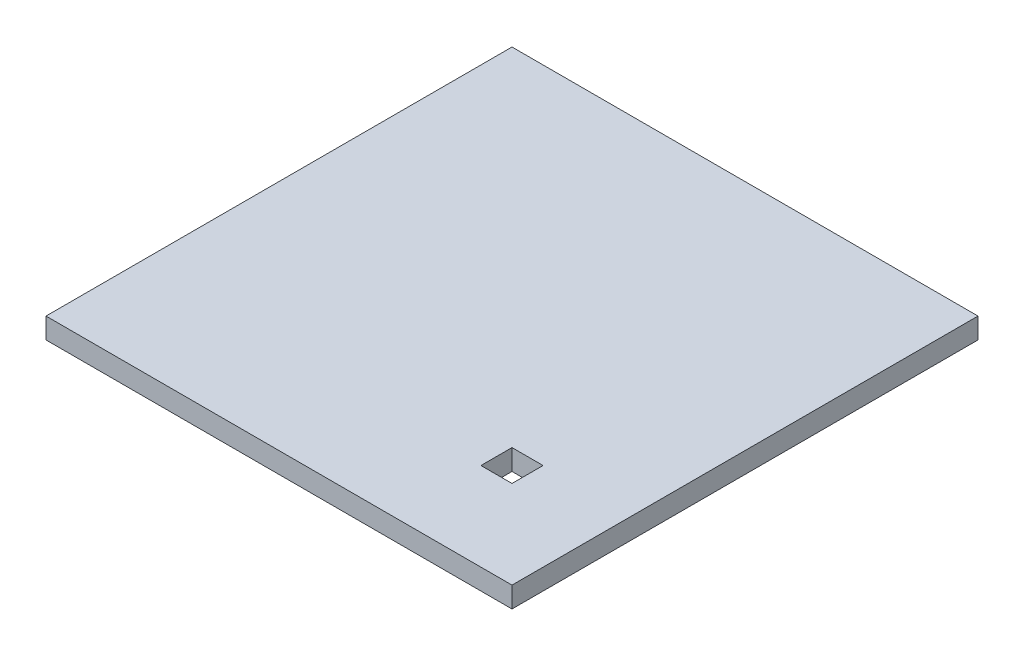
ISO-10303-21;
HEADER;
FILE_DESCRIPTION(('STEP AP214'),'2;1');
FILE_NAME('part.step','',(''),(''),'','','');
FILE_SCHEMA(('AUTOMOTIVE_DESIGN { 1 0 10303 214 1 1 1 1 }'));
ENDSEC;
DATA;
#1=APPLICATION_CONTEXT('core data for automotive mechanical design processes');
#2=APPLICATION_PROTOCOL_DEFINITION('international standard','automotive_design',2000,#1);
#3=PRODUCT_CONTEXT('',#1,'mechanical');
#4=PRODUCT('Part','Part','',(#3));
#5=PRODUCT_RELATED_PRODUCT_CATEGORY('part','',(#4));
#6=PRODUCT_DEFINITION_FORMATION('','',#4);
#7=PRODUCT_DEFINITION_CONTEXT('part definition',#1,'design');
#8=PRODUCT_DEFINITION('design','',#6,#7);
#9=PRODUCT_DEFINITION_SHAPE('','',#8);
#10=(LENGTH_UNIT() NAMED_UNIT(*) SI_UNIT(.MILLI.,.METRE.));
#11=(NAMED_UNIT(*) PLANE_ANGLE_UNIT() SI_UNIT($,.RADIAN.));
#12=(NAMED_UNIT(*) SI_UNIT($,.STERADIAN.) SOLID_ANGLE_UNIT());
#13=UNCERTAINTY_MEASURE_WITH_UNIT(LENGTH_MEASURE(1.E-05),#10,'distance_accuracy_value','');
#14=(GEOMETRIC_REPRESENTATION_CONTEXT(3) GLOBAL_UNCERTAINTY_ASSIGNED_CONTEXT((#13)) GLOBAL_UNIT_ASSIGNED_CONTEXT((#10,
#11,#12)) REPRESENTATION_CONTEXT('',''));
#15=CARTESIAN_POINT('',(0.,0.,0.));
#16=DIRECTION('',(0.,0.,1.));
#17=DIRECTION('',(1.,0.,0.));
#18=AXIS2_PLACEMENT_3D('',#15,#16,#17);
#19=CARTESIAN_POINT('',(0.,2.,0.));
#20=DIRECTION('',(1.,0.,0.));
#21=DIRECTION('',(0.,0.,-1.));
#22=AXIS2_PLACEMENT_3D('',#19,#20,#21);
#23=PLANE('',#22);
#24=DIRECTION('',(0.,0.,1.));
#25=VECTOR('',#24,1.);
#26=CARTESIAN_POINT('',(0.,0.,0.));
#27=LINE('',#26,#25);
#28=CARTESIAN_POINT('',(0.,0.,-45.));
#29=VERTEX_POINT('',#28);
#30=CARTESIAN_POINT('',(0.,0.,0.));
#31=VERTEX_POINT('',#30);
#32=EDGE_CURVE('E122',#29,#31,#27,.T.);
#33=ORIENTED_EDGE('',*,*,#32,.T.);
#34=DIRECTION('',(0.,-1.,0.));
#35=VECTOR('',#34,1.);
#36=CARTESIAN_POINT('',(0.,2.,0.));
#37=LINE('',#36,#35);
#38=CARTESIAN_POINT('',(0.,2.,0.));
#39=VERTEX_POINT('',#38);
#40=EDGE_CURVE('E151',#39,#31,#37,.T.);
#41=ORIENTED_EDGE('',*,*,#40,.F.);
#42=DIRECTION('',(0.,0.,1.));
#43=VECTOR('',#42,1.);
#44=CARTESIAN_POINT('',(0.,2.,0.));
#45=LINE('',#44,#43);
#46=CARTESIAN_POINT('',(0.,2.,-45.));
#47=VERTEX_POINT('',#46);
#48=EDGE_CURVE('E125',#47,#39,#45,.T.);
#49=ORIENTED_EDGE('',*,*,#48,.F.);
#50=DIRECTION('',(0.,-1.,0.));
#51=VECTOR('',#50,1.);
#52=CARTESIAN_POINT('',(0.,2.,-45.));
#53=LINE('',#52,#51);
#54=EDGE_CURVE('E135',#47,#29,#53,.T.);
#55=ORIENTED_EDGE('',*,*,#54,.T.);
#56=EDGE_LOOP('',(#33,#41,#49,#55));
#57=FACE_BOUND('',#56,.T.);
#58=ADVANCED_FACE('F33',(#57),#23,.F.);
#59=CARTESIAN_POINT('',(0.,2.,0.));
#60=DIRECTION('',(0.,0.,-1.));
#61=DIRECTION('',(-1.,0.,0.));
#62=AXIS2_PLACEMENT_3D('',#59,#60,#61);
#63=PLANE('',#62);
#64=DIRECTION('',(1.,0.,0.));
#65=VECTOR('',#64,1.);
#66=CARTESIAN_POINT('',(0.,0.,0.));
#67=LINE('',#66,#65);
#68=CARTESIAN_POINT('',(45.,0.,0.));
#69=VERTEX_POINT('',#68);
#70=EDGE_CURVE('E138',#31,#69,#67,.T.);
#71=ORIENTED_EDGE('',*,*,#70,.T.);
#72=DIRECTION('',(0.,-1.,0.));
#73=VECTOR('',#72,1.);
#74=CARTESIAN_POINT('',(45.,2.,0.));
#75=LINE('',#74,#73);
#76=CARTESIAN_POINT('',(45.,2.,0.));
#77=VERTEX_POINT('',#76);
#78=EDGE_CURVE('E148',#77,#69,#75,.T.);
#79=ORIENTED_EDGE('',*,*,#78,.F.);
#80=DIRECTION('',(1.,0.,0.));
#81=VECTOR('',#80,1.);
#82=CARTESIAN_POINT('',(0.,2.,0.));
#83=LINE('',#82,#81);
#84=EDGE_CURVE('E128',#39,#77,#83,.T.);
#85=ORIENTED_EDGE('',*,*,#84,.F.);
#86=ORIENTED_EDGE('',*,*,#40,.T.);
#87=EDGE_LOOP('',(#71,#79,#85,#86));
#88=FACE_BOUND('',#87,.T.);
#89=ADVANCED_FACE('F177',(#88),#63,.F.);
#90=CARTESIAN_POINT('',(45.,2.,0.));
#91=DIRECTION('',(-1.,0.,0.));
#92=DIRECTION('',(0.,0.,1.));
#93=AXIS2_PLACEMENT_3D('',#90,#91,#92);
#94=PLANE('',#93);
#95=DIRECTION('',(0.,0.,-1.));
#96=VECTOR('',#95,1.);
#97=CARTESIAN_POINT('',(45.,0.,0.));
#98=LINE('',#97,#96);
#99=CARTESIAN_POINT('',(45.,0.,-45.));
#100=VERTEX_POINT('',#99);
#101=EDGE_CURVE('E140',#69,#100,#98,.T.);
#102=ORIENTED_EDGE('',*,*,#101,.T.);
#103=DIRECTION('',(0.,-1.,0.));
#104=VECTOR('',#103,1.);
#105=CARTESIAN_POINT('',(45.,2.,-45.));
#106=LINE('',#105,#104);
#107=CARTESIAN_POINT('',(45.,2.,-45.));
#108=VERTEX_POINT('',#107);
#109=EDGE_CURVE('E145',#108,#100,#106,.T.);
#110=ORIENTED_EDGE('',*,*,#109,.F.);
#111=DIRECTION('',(0.,0.,-1.));
#112=VECTOR('',#111,1.);
#113=CARTESIAN_POINT('',(45.,2.,0.));
#114=LINE('',#113,#112);
#115=EDGE_CURVE('E131',#77,#108,#114,.T.);
#116=ORIENTED_EDGE('',*,*,#115,.F.);
#117=ORIENTED_EDGE('',*,*,#78,.T.);
#118=EDGE_LOOP('',(#102,#110,#116,#117));
#119=FACE_BOUND('',#118,.T.);
#120=ADVANCED_FACE('F182',(#119),#94,.F.);
#121=CARTESIAN_POINT('',(0.,2.,-45.));
#122=DIRECTION('',(0.,0.,1.));
#123=DIRECTION('',(1.,0.,0.));
#124=AXIS2_PLACEMENT_3D('',#121,#122,#123);
#125=PLANE('',#124);
#126=DIRECTION('',(-1.,0.,0.));
#127=VECTOR('',#126,1.);
#128=CARTESIAN_POINT('',(0.,0.,-45.));
#129=LINE('',#128,#127);
#130=EDGE_CURVE('E129',#100,#29,#129,.T.);
#131=ORIENTED_EDGE('',*,*,#130,.T.);
#132=ORIENTED_EDGE('',*,*,#54,.F.);
#133=DIRECTION('',(-1.,0.,0.));
#134=VECTOR('',#133,1.);
#135=CARTESIAN_POINT('',(0.,2.,-45.));
#136=LINE('',#135,#134);
#137=EDGE_CURVE('E133',#108,#47,#136,.T.);
#138=ORIENTED_EDGE('',*,*,#137,.F.);
#139=ORIENTED_EDGE('',*,*,#109,.T.);
#140=EDGE_LOOP('',(#131,#132,#138,#139));
#141=FACE_BOUND('',#140,.T.);
#142=ADVANCED_FACE('F195',(#141),#125,.F.);
#143=CARTESIAN_POINT('',(0.,2.,0.));
#144=DIRECTION('',(0.,-1.,0.));
#145=DIRECTION('',(0.,0.,-1.));
#146=AXIS2_PLACEMENT_3D('',#143,#144,#145);
#147=PLANE('',#146);
#148=DIRECTION('',(-1.,0.,0.));
#149=VECTOR('',#148,1.);
#150=CARTESIAN_POINT('',(36.5,2.,-11.5));
#151=LINE('',#150,#149);
#152=CARTESIAN_POINT('',(36.5,2.,-11.5));
#153=VERTEX_POINT('',#152);
#154=CARTESIAN_POINT('',(33.5,2.,-11.5));
#155=VERTEX_POINT('',#154);
#156=EDGE_CURVE('E108',#153,#155,#151,.T.);
#157=ORIENTED_EDGE('',*,*,#156,.F.);
#158=DIRECTION('',(0.,0.,-1.));
#159=VECTOR('',#158,1.);
#160=CARTESIAN_POINT('',(36.5,2.,-8.5));
#161=LINE('',#160,#159);
#162=CARTESIAN_POINT('',(36.5,2.,-8.5));
#163=VERTEX_POINT('',#162);
#164=EDGE_CURVE('E47',#163,#153,#161,.T.);
#165=ORIENTED_EDGE('',*,*,#164,.F.);
#166=DIRECTION('',(1.,0.,0.));
#167=VECTOR('',#166,1.);
#168=CARTESIAN_POINT('',(36.5,2.,-8.5));
#169=LINE('',#168,#167);
#170=CARTESIAN_POINT('',(33.5,2.,-8.5));
#171=VERTEX_POINT('',#170);
#172=EDGE_CURVE('E115',#171,#163,#169,.T.);
#173=ORIENTED_EDGE('',*,*,#172,.F.);
#174=DIRECTION('',(0.,0.,1.));
#175=VECTOR('',#174,1.);
#176=CARTESIAN_POINT('',(33.5,2.,-8.5));
#177=LINE('',#176,#175);
#178=EDGE_CURVE('E99',#155,#171,#177,.T.);
#179=ORIENTED_EDGE('',*,*,#178,.F.);
#180=EDGE_LOOP('',(#157,#165,#173,#179));
#181=FACE_BOUND('',#180,.T.);
#182=ORIENTED_EDGE('',*,*,#48,.T.);
#183=ORIENTED_EDGE('',*,*,#84,.T.);
#184=ORIENTED_EDGE('',*,*,#115,.T.);
#185=ORIENTED_EDGE('',*,*,#137,.T.);
#186=EDGE_LOOP('',(#182,#183,#184,#185));
#187=FACE_BOUND('',#186,.T.);
#188=ADVANCED_FACE('F112',(#181,#187),#147,.F.);
#189=CARTESIAN_POINT('',(0.,0.,0.));
#190=DIRECTION('',(0.,-1.,0.));
#191=DIRECTION('',(0.,0.,-1.));
#192=AXIS2_PLACEMENT_3D('',#189,#190,#191);
#193=PLANE('',#192);
#194=DIRECTION('',(0.,0.,1.));
#195=VECTOR('',#194,1.);
#196=CARTESIAN_POINT('',(36.5,0.,0.));
#197=LINE('',#196,#195);
#198=CARTESIAN_POINT('',(36.5,0.,-11.5));
#199=VERTEX_POINT('',#198);
#200=CARTESIAN_POINT('',(36.5,0.,-8.5));
#201=VERTEX_POINT('',#200);
#202=EDGE_CURVE('E11',#199,#201,#197,.T.);
#203=ORIENTED_EDGE('',*,*,#202,.F.);
#204=DIRECTION('',(1.,0.,0.));
#205=VECTOR('',#204,1.);
#206=CARTESIAN_POINT('',(0.,0.,-11.5));
#207=LINE('',#206,#205);
#208=CARTESIAN_POINT('',(33.5,0.,-11.5));
#209=VERTEX_POINT('',#208);
#210=EDGE_CURVE('E154',#209,#199,#207,.T.);
#211=ORIENTED_EDGE('',*,*,#210,.F.);
#212=DIRECTION('',(0.,0.,-1.));
#213=VECTOR('',#212,1.);
#214=CARTESIAN_POINT('',(33.5,0.,0.));
#215=LINE('',#214,#213);
#216=CARTESIAN_POINT('',(33.5,0.,-8.5));
#217=VERTEX_POINT('',#216);
#218=EDGE_CURVE('E102',#217,#209,#215,.T.);
#219=ORIENTED_EDGE('',*,*,#218,.F.);
#220=DIRECTION('',(-1.,0.,0.));
#221=VECTOR('',#220,1.);
#222=CARTESIAN_POINT('',(0.,0.,-8.5));
#223=LINE('',#222,#221);
#224=EDGE_CURVE('E40',#201,#217,#223,.T.);
#225=ORIENTED_EDGE('',*,*,#224,.F.);
#226=EDGE_LOOP('',(#203,#211,#219,#225));
#227=FACE_BOUND('',#226,.T.);
#228=ORIENTED_EDGE('',*,*,#32,.F.);
#229=ORIENTED_EDGE('',*,*,#130,.F.);
#230=ORIENTED_EDGE('',*,*,#101,.F.);
#231=ORIENTED_EDGE('',*,*,#70,.F.);
#232=EDGE_LOOP('',(#228,#229,#230,#231));
#233=FACE_BOUND('',#232,.T.);
#234=ADVANCED_FACE('F162',(#227,#233),#193,.T.);
#235=CARTESIAN_POINT('',(36.5,-3.,-8.5));
#236=DIRECTION('',(1.,0.,0.));
#237=DIRECTION('',(0.,0.,-1.));
#238=AXIS2_PLACEMENT_3D('',#235,#236,#237);
#239=PLANE('',#238);
#240=ORIENTED_EDGE('',*,*,#202,.T.);
#241=DIRECTION('',(0.,1.,0.));
#242=VECTOR('',#241,1.);
#243=CARTESIAN_POINT('',(36.5,-3.,-8.5));
#244=LINE('',#243,#242);
#245=EDGE_CURVE('E120',#201,#163,#244,.T.);
#246=ORIENTED_EDGE('',*,*,#245,.T.);
#247=ORIENTED_EDGE('',*,*,#164,.T.);
#248=DIRECTION('',(0.,1.,0.));
#249=VECTOR('',#248,1.);
#250=CARTESIAN_POINT('',(36.5,-3.,-11.5));
#251=LINE('',#250,#249);
#252=EDGE_CURVE('E105',#199,#153,#251,.T.);
#253=ORIENTED_EDGE('',*,*,#252,.F.);
#254=EDGE_LOOP('',(#240,#246,#247,#253));
#255=FACE_BOUND('',#254,.T.);
#256=ADVANCED_FACE('F164',(#255),#239,.F.);
#257=CARTESIAN_POINT('',(36.5,-3.,-8.5));
#258=DIRECTION('',(0.,0.,1.));
#259=DIRECTION('',(1.,0.,0.));
#260=AXIS2_PLACEMENT_3D('',#257,#258,#259);
#261=PLANE('',#260);
#262=ORIENTED_EDGE('',*,*,#224,.T.);
#263=DIRECTION('',(0.,1.,0.));
#264=VECTOR('',#263,1.);
#265=CARTESIAN_POINT('',(33.5,-3.,-8.5));
#266=LINE('',#265,#264);
#267=EDGE_CURVE('E104',#217,#171,#266,.T.);
#268=ORIENTED_EDGE('',*,*,#267,.T.);
#269=ORIENTED_EDGE('',*,*,#172,.T.);
#270=ORIENTED_EDGE('',*,*,#245,.F.);
#271=EDGE_LOOP('',(#262,#268,#269,#270));
#272=FACE_BOUND('',#271,.T.);
#273=ADVANCED_FACE('F159',(#272),#261,.F.);
#274=CARTESIAN_POINT('',(33.5,-3.,-8.5));
#275=DIRECTION('',(-1.,0.,0.));
#276=DIRECTION('',(0.,0.,1.));
#277=AXIS2_PLACEMENT_3D('',#274,#275,#276);
#278=PLANE('',#277);
#279=ORIENTED_EDGE('',*,*,#218,.T.);
#280=DIRECTION('',(0.,1.,0.));
#281=VECTOR('',#280,1.);
#282=CARTESIAN_POINT('',(33.5,-3.,-11.5));
#283=LINE('',#282,#281);
#284=EDGE_CURVE('E55',#209,#155,#283,.T.);
#285=ORIENTED_EDGE('',*,*,#284,.T.);
#286=ORIENTED_EDGE('',*,*,#178,.T.);
#287=ORIENTED_EDGE('',*,*,#267,.F.);
#288=EDGE_LOOP('',(#279,#285,#286,#287));
#289=FACE_BOUND('',#288,.T.);
#290=ADVANCED_FACE('F96',(#289),#278,.F.);
#291=CARTESIAN_POINT('',(36.5,-3.,-11.5));
#292=DIRECTION('',(0.,0.,-1.));
#293=DIRECTION('',(-1.,0.,0.));
#294=AXIS2_PLACEMENT_3D('',#291,#292,#293);
#295=PLANE('',#294);
#296=ORIENTED_EDGE('',*,*,#210,.T.);
#297=ORIENTED_EDGE('',*,*,#252,.T.);
#298=ORIENTED_EDGE('',*,*,#156,.T.);
#299=ORIENTED_EDGE('',*,*,#284,.F.);
#300=EDGE_LOOP('',(#296,#297,#298,#299));
#301=FACE_BOUND('',#300,.T.);
#302=ADVANCED_FACE('F109',(#301),#295,.F.);
#303=CLOSED_SHELL('',(#58,#89,#120,#142,#188,#234,#256,#273,#290,#302));
#304=MANIFOLD_SOLID_BREP('B2',#303);
#305=ADVANCED_BREP_SHAPE_REPRESENTATION('',(#18,#304),#14);
#306=SHAPE_DEFINITION_REPRESENTATION(#9,#305);
ENDSEC;
END-ISO-10303-21;
